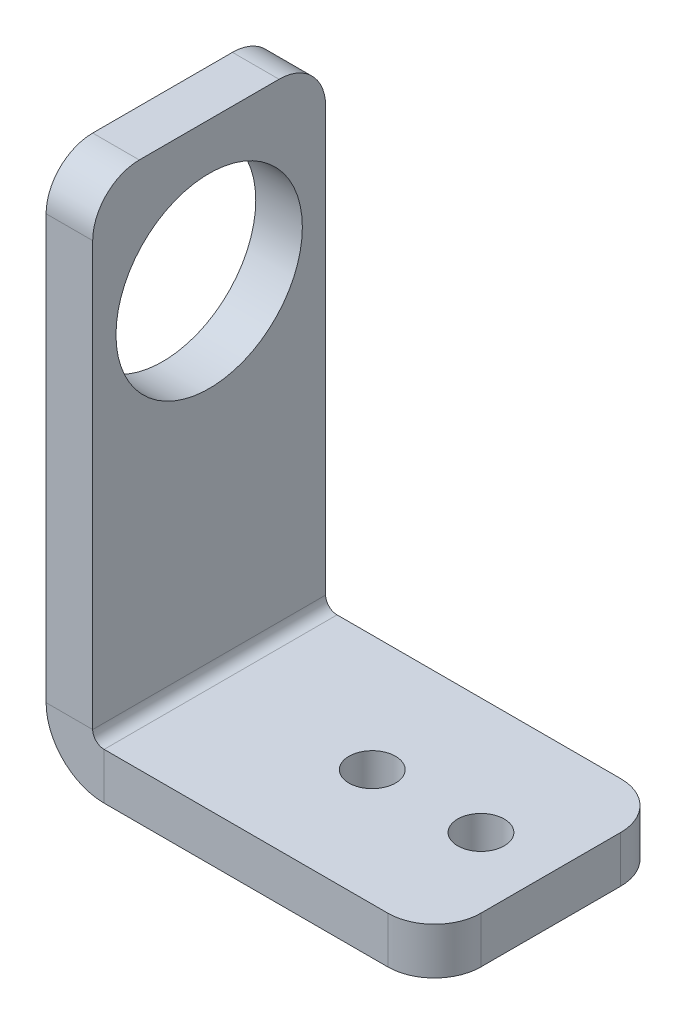
ISO-10303-21;
HEADER;
FILE_DESCRIPTION(('STEP AP214'),'2;1');
FILE_NAME('part.step','',(''),(''),'','','');
FILE_SCHEMA(('AUTOMOTIVE_DESIGN { 1 0 10303 214 1 1 1 1 }'));
ENDSEC;
DATA;
#1=APPLICATION_CONTEXT('core data for automotive mechanical design processes');
#2=APPLICATION_PROTOCOL_DEFINITION('international standard','automotive_design',2000,#1);
#3=PRODUCT_CONTEXT('',#1,'mechanical');
#4=PRODUCT('Part','Part','',(#3));
#5=PRODUCT_RELATED_PRODUCT_CATEGORY('part','',(#4));
#6=PRODUCT_DEFINITION_FORMATION('','',#4);
#7=PRODUCT_DEFINITION_CONTEXT('part definition',#1,'design');
#8=PRODUCT_DEFINITION('design','',#6,#7);
#9=PRODUCT_DEFINITION_SHAPE('','',#8);
#10=(LENGTH_UNIT() NAMED_UNIT(*) SI_UNIT(.MILLI.,.METRE.));
#11=(NAMED_UNIT(*) PLANE_ANGLE_UNIT() SI_UNIT($,.RADIAN.));
#12=(NAMED_UNIT(*) SI_UNIT($,.STERADIAN.) SOLID_ANGLE_UNIT());
#13=UNCERTAINTY_MEASURE_WITH_UNIT(LENGTH_MEASURE(1.E-05),#10,'distance_accuracy_value','');
#14=(GEOMETRIC_REPRESENTATION_CONTEXT(3) GLOBAL_UNCERTAINTY_ASSIGNED_CONTEXT((#13)) GLOBAL_UNIT_ASSIGNED_CONTEXT((#10,
#11,#12)) REPRESENTATION_CONTEXT('',''));
#15=CARTESIAN_POINT('',(0.,0.,0.));
#16=DIRECTION('',(0.,0.,1.));
#17=DIRECTION('',(1.,0.,0.));
#18=AXIS2_PLACEMENT_3D('',#15,#16,#17);
#19=CARTESIAN_POINT('',(-25.,3.7366,7.5));
#20=DIRECTION('',(0.,0.,1.));
#21=DIRECTION('',(1.,0.,0.));
#22=AXIS2_PLACEMENT_3D('',#19,#20,#21);
#23=PLANE('',#22);
#24=DIRECTION('',(1.,0.,0.));
#25=VECTOR('',#24,1.);
#26=CARTESIAN_POINT('',(-25.,3.7366,7.5));
#27=LINE('',#26,#25);
#28=CARTESIAN_POINT('',(-25.,3.7366,7.5));
#29=VERTEX_POINT('',#28);
#30=CARTESIAN_POINT('',(-22.,3.7366,7.5));
#31=VERTEX_POINT('',#30);
#32=EDGE_CURVE('E133',#29,#31,#27,.T.);
#33=ORIENTED_EDGE('',*,*,#32,.F.);
#34=CARTESIAN_POINT('',(-21.2634,3.7366,7.5));
#35=DIRECTION('',(0.,0.,1.));
#36=DIRECTION('',(1.,0.,0.));
#37=AXIS2_PLACEMENT_3D('',#34,#35,#36);
#38=CIRCLE('',#37,3.7366);
#39=CARTESIAN_POINT('',(-21.2634,0.,7.5));
#40=VERTEX_POINT('',#39);
#41=EDGE_CURVE('E137',#40,#29,#38,.F.);
#42=ORIENTED_EDGE('',*,*,#41,.F.);
#43=DIRECTION('',(0.,-1.,0.));
#44=VECTOR('',#43,1.);
#45=CARTESIAN_POINT('',(-21.2634,3.,7.5));
#46=LINE('',#45,#44);
#47=CARTESIAN_POINT('',(-21.2634,3.,7.5));
#48=VERTEX_POINT('',#47);
#49=EDGE_CURVE('E142',#48,#40,#46,.T.);
#50=ORIENTED_EDGE('',*,*,#49,.F.);
#51=CARTESIAN_POINT('',(-21.2634,3.7366,7.5));
#52=DIRECTION('',(0.,0.,1.));
#53=DIRECTION('',(1.,0.,0.));
#54=AXIS2_PLACEMENT_3D('',#51,#52,#53);
#55=CIRCLE('',#54,0.7366);
#56=EDGE_CURVE('E139',#48,#31,#55,.F.);
#57=ORIENTED_EDGE('',*,*,#56,.T.);
#58=EDGE_LOOP('',(#33,#42,#50,#57));
#59=FACE_BOUND('',#58,.T.);
#60=ADVANCED_FACE('F42',(#59),#23,.T.);
#61=CARTESIAN_POINT('',(-21.2634,3.,7.5));
#62=DIRECTION('',(0.,0.,1.));
#63=DIRECTION('',(1.,0.,0.));
#64=AXIS2_PLACEMENT_3D('',#61,#62,#63);
#65=PLANE('',#64);
#66=DIRECTION('',(0.,1.,0.));
#67=VECTOR('',#66,1.);
#68=CARTESIAN_POINT('',(-22.,0.,7.5));
#69=LINE('',#68,#67);
#70=CARTESIAN_POINT('',(-22.,31.,7.5));
#71=VERTEX_POINT('',#70);
#72=EDGE_CURVE('E160',#31,#71,#69,.T.);
#73=ORIENTED_EDGE('',*,*,#72,.T.);
#74=DIRECTION('',(1.,0.,0.));
#75=VECTOR('',#74,1.);
#76=CARTESIAN_POINT('',(-21.2634,31.,7.5));
#77=LINE('',#76,#75);
#78=CARTESIAN_POINT('',(-25.,31.,7.5));
#79=VERTEX_POINT('',#78);
#80=EDGE_CURVE('E11',#71,#79,#77,.F.);
#81=ORIENTED_EDGE('',*,*,#80,.T.);
#82=DIRECTION('',(0.,1.,0.));
#83=VECTOR('',#82,1.);
#84=CARTESIAN_POINT('',(-25.,0.,7.5));
#85=LINE('',#84,#83);
#86=EDGE_CURVE('E149',#29,#79,#85,.T.);
#87=ORIENTED_EDGE('',*,*,#86,.F.);
#88=ORIENTED_EDGE('',*,*,#32,.T.);
#89=EDGE_LOOP('',(#73,#81,#87,#88));
#90=FACE_BOUND('',#89,.T.);
#91=ADVANCED_FACE('F159',(#90),#65,.T.);
#92=CARTESIAN_POINT('',(-21.2634,0.,-7.5));
#93=DIRECTION('',(0.,0.,-1.));
#94=DIRECTION('',(-1.,0.,0.));
#95=AXIS2_PLACEMENT_3D('',#92,#93,#94);
#96=PLANE('',#95);
#97=DIRECTION('',(0.,1.,0.));
#98=VECTOR('',#97,1.);
#99=CARTESIAN_POINT('',(-21.2634,0.,-7.5));
#100=LINE('',#99,#98);
#101=CARTESIAN_POINT('',(-21.2634,0.,-7.5));
#102=VERTEX_POINT('',#101);
#103=CARTESIAN_POINT('',(-21.2634,3.,-7.5));
#104=VERTEX_POINT('',#103);
#105=EDGE_CURVE('E205',#102,#104,#100,.T.);
#106=ORIENTED_EDGE('',*,*,#105,.F.);
#107=CARTESIAN_POINT('',(-21.2634,3.7366,-7.5));
#108=DIRECTION('',(0.,0.,1.));
#109=DIRECTION('',(1.,0.,0.));
#110=AXIS2_PLACEMENT_3D('',#107,#108,#109);
#111=CIRCLE('',#110,3.7366);
#112=CARTESIAN_POINT('',(-25.,3.7366,-7.5));
#113=VERTEX_POINT('',#112);
#114=EDGE_CURVE('E179',#102,#113,#111,.F.);
#115=ORIENTED_EDGE('',*,*,#114,.T.);
#116=DIRECTION('',(-1.,0.,0.));
#117=VECTOR('',#116,1.);
#118=CARTESIAN_POINT('',(-22.,3.7366,-7.5));
#119=LINE('',#118,#117);
#120=CARTESIAN_POINT('',(-22.,3.7366,-7.5));
#121=VERTEX_POINT('',#120);
#122=EDGE_CURVE('E203',#121,#113,#119,.T.);
#123=ORIENTED_EDGE('',*,*,#122,.F.);
#124=CARTESIAN_POINT('',(-21.2634,3.7366,-7.5));
#125=DIRECTION('',(0.,0.,1.));
#126=DIRECTION('',(1.,0.,0.));
#127=AXIS2_PLACEMENT_3D('',#124,#125,#126);
#128=CIRCLE('',#127,0.7366);
#129=EDGE_CURVE('E185',#104,#121,#128,.F.);
#130=ORIENTED_EDGE('',*,*,#129,.F.);
#131=EDGE_LOOP('',(#106,#115,#123,#130));
#132=FACE_BOUND('',#131,.T.);
#133=ADVANCED_FACE('F316',(#132),#96,.T.);
#134=CARTESIAN_POINT('',(-22.,3.7366,-7.5));
#135=DIRECTION('',(0.,0.,-1.));
#136=DIRECTION('',(-1.,0.,0.));
#137=AXIS2_PLACEMENT_3D('',#134,#135,#136);
#138=PLANE('',#137);
#139=DIRECTION('',(-1.,0.,0.));
#140=VECTOR('',#139,1.);
#141=CARTESIAN_POINT('',(0.,3.,-7.5));
#142=LINE('',#141,#140);
#143=CARTESIAN_POINT('',(-3.,3.,-7.5));
#144=VERTEX_POINT('',#143);
#145=EDGE_CURVE('E183',#144,#104,#142,.T.);
#146=ORIENTED_EDGE('',*,*,#145,.F.);
#147=DIRECTION('',(0.,-1.,0.));
#148=VECTOR('',#147,1.);
#149=CARTESIAN_POINT('',(-3.,3.7366,-7.5));
#150=LINE('',#149,#148);
#151=CARTESIAN_POINT('',(-3.,0.,-7.5));
#152=VERTEX_POINT('',#151);
#153=EDGE_CURVE('E224',#144,#152,#150,.T.);
#154=ORIENTED_EDGE('',*,*,#153,.T.);
#155=DIRECTION('',(-1.,0.,0.));
#156=VECTOR('',#155,1.);
#157=CARTESIAN_POINT('',(0.,0.,-7.5));
#158=LINE('',#157,#156);
#159=EDGE_CURVE('E181',#152,#102,#158,.T.);
#160=ORIENTED_EDGE('',*,*,#159,.T.);
#161=ORIENTED_EDGE('',*,*,#105,.T.);
#162=EDGE_LOOP('',(#146,#154,#160,#161));
#163=FACE_BOUND('',#162,.T.);
#164=ADVANCED_FACE('F311',(#163),#138,.T.);
#165=CARTESIAN_POINT('',(-22.,0.,7.5));
#166=DIRECTION('',(-1.,0.,0.));
#167=DIRECTION('',(0.,0.,1.));
#168=AXIS2_PLACEMENT_3D('',#165,#166,#167);
#169=PLANE('',#168);
#170=CARTESIAN_POINT('',(-22.,25.,0.));
#171=DIRECTION('',(-1.,0.,0.));
#172=DIRECTION('',(0.,0.,1.));
#173=AXIS2_PLACEMENT_3D('',#170,#171,#172);
#174=CIRCLE('',#173,6.);
#175=CARTESIAN_POINT('',(-22.,25.,6.));
#176=VERTEX_POINT('',#175);
#177=EDGE_CURVE('E177',#176,#176,#174,.T.);
#178=ORIENTED_EDGE('',*,*,#177,.T.);
#179=EDGE_LOOP('',(#178));
#180=FACE_BOUND('',#179,.T.);
#181=DIRECTION('',(0.,1.,0.));
#182=VECTOR('',#181,1.);
#183=CARTESIAN_POINT('',(-22.,0.,-7.5));
#184=LINE('',#183,#182);
#185=CARTESIAN_POINT('',(-22.,31.,-7.5));
#186=VERTEX_POINT('',#185);
#187=EDGE_CURVE('E174',#121,#186,#184,.T.);
#188=ORIENTED_EDGE('',*,*,#187,.T.);
#189=CARTESIAN_POINT('',(-22.,31.,-4.5));
#190=DIRECTION('',(-1.,0.,0.));
#191=DIRECTION('',(0.,0.,1.));
#192=AXIS2_PLACEMENT_3D('',#189,#190,#191);
#193=CIRCLE('',#192,3.);
#194=CARTESIAN_POINT('',(-22.,34.,-4.5));
#195=VERTEX_POINT('',#194);
#196=EDGE_CURVE('E232',#186,#195,#193,.F.);
#197=ORIENTED_EDGE('',*,*,#196,.T.);
#198=DIRECTION('',(0.,0.,-1.));
#199=VECTOR('',#198,1.);
#200=CARTESIAN_POINT('',(-22.,34.,7.5));
#201=LINE('',#200,#199);
#202=CARTESIAN_POINT('',(-22.,34.,4.5));
#203=VERTEX_POINT('',#202);
#204=EDGE_CURVE('E201',#203,#195,#201,.T.);
#205=ORIENTED_EDGE('',*,*,#204,.F.);
#206=CARTESIAN_POINT('',(-22.,31.,4.5));
#207=DIRECTION('',(-1.,0.,0.));
#208=DIRECTION('',(0.,0.,1.));
#209=AXIS2_PLACEMENT_3D('',#206,#207,#208);
#210=CIRCLE('',#209,3.);
#211=EDGE_CURVE('E230',#203,#71,#210,.F.);
#212=ORIENTED_EDGE('',*,*,#211,.T.);
#213=ORIENTED_EDGE('',*,*,#72,.F.);
#214=DIRECTION('',(0.,0.,-1.));
#215=VECTOR('',#214,1.);
#216=CARTESIAN_POINT('',(-22.,3.7366,7.5));
#217=LINE('',#216,#215);
#218=EDGE_CURVE('E173',#31,#121,#217,.T.);
#219=ORIENTED_EDGE('',*,*,#218,.T.);
#220=EDGE_LOOP('',(#188,#197,#205,#212,#213,#219));
#221=FACE_BOUND('',#220,.T.);
#222=ADVANCED_FACE('F248',(#180,#221),#169,.F.);
#223=CARTESIAN_POINT('',(-25.,34.,7.5));
#224=DIRECTION('',(0.,1.,0.));
#225=DIRECTION('',(0.,0.,1.));
#226=AXIS2_PLACEMENT_3D('',#223,#224,#225);
#227=PLANE('',#226);
#228=ORIENTED_EDGE('',*,*,#204,.T.);
#229=DIRECTION('',(1.,0.,0.));
#230=VECTOR('',#229,1.);
#231=CARTESIAN_POINT('',(-25.,34.,-4.5));
#232=LINE('',#231,#230);
#233=CARTESIAN_POINT('',(-25.,34.,-4.5));
#234=VERTEX_POINT('',#233);
#235=EDGE_CURVE('E63',#195,#234,#232,.F.);
#236=ORIENTED_EDGE('',*,*,#235,.T.);
#237=DIRECTION('',(0.,0.,-1.));
#238=VECTOR('',#237,1.);
#239=CARTESIAN_POINT('',(-25.,34.,7.5));
#240=LINE('',#239,#238);
#241=CARTESIAN_POINT('',(-25.,34.,4.5));
#242=VERTEX_POINT('',#241);
#243=EDGE_CURVE('E156',#242,#234,#240,.T.);
#244=ORIENTED_EDGE('',*,*,#243,.F.);
#245=DIRECTION('',(1.,0.,0.));
#246=VECTOR('',#245,1.);
#247=CARTESIAN_POINT('',(-25.,34.,4.5));
#248=LINE('',#247,#246);
#249=EDGE_CURVE('E234',#242,#203,#248,.T.);
#250=ORIENTED_EDGE('',*,*,#249,.T.);
#251=EDGE_LOOP('',(#228,#236,#244,#250));
#252=FACE_BOUND('',#251,.T.);
#253=ADVANCED_FACE('F249',(#252),#227,.T.);
#254=CARTESIAN_POINT('',(-25.,0.,7.5));
#255=DIRECTION('',(-1.,0.,0.));
#256=DIRECTION('',(0.,0.,1.));
#257=AXIS2_PLACEMENT_3D('',#254,#255,#256);
#258=PLANE('',#257);
#259=CARTESIAN_POINT('',(-25.,25.,0.));
#260=DIRECTION('',(-1.,0.,0.));
#261=DIRECTION('',(0.,0.,1.));
#262=AXIS2_PLACEMENT_3D('',#259,#260,#261);
#263=CIRCLE('',#262,6.);
#264=CARTESIAN_POINT('',(-25.,25.,6.));
#265=VERTEX_POINT('',#264);
#266=EDGE_CURVE('E256',#265,#265,#263,.T.);
#267=ORIENTED_EDGE('',*,*,#266,.F.);
#268=EDGE_LOOP('',(#267));
#269=FACE_BOUND('',#268,.T.);
#270=ORIENTED_EDGE('',*,*,#243,.T.);
#271=CARTESIAN_POINT('',(-25.,31.,-4.5));
#272=DIRECTION('',(-1.,0.,0.));
#273=DIRECTION('',(0.,0.,1.));
#274=AXIS2_PLACEMENT_3D('',#271,#272,#273);
#275=CIRCLE('',#274,3.);
#276=CARTESIAN_POINT('',(-25.,31.,-7.5));
#277=VERTEX_POINT('',#276);
#278=EDGE_CURVE('E50',#234,#277,#275,.T.);
#279=ORIENTED_EDGE('',*,*,#278,.T.);
#280=DIRECTION('',(0.,1.,0.));
#281=VECTOR('',#280,1.);
#282=CARTESIAN_POINT('',(-25.,0.,-7.5));
#283=LINE('',#282,#281);
#284=EDGE_CURVE('E152',#113,#277,#283,.T.);
#285=ORIENTED_EDGE('',*,*,#284,.F.);
#286=DIRECTION('',(0.,0.,-1.));
#287=VECTOR('',#286,1.);
#288=CARTESIAN_POINT('',(-25.,3.7366,7.5));
#289=LINE('',#288,#287);
#290=EDGE_CURVE('E147',#29,#113,#289,.T.);
#291=ORIENTED_EDGE('',*,*,#290,.F.);
#292=ORIENTED_EDGE('',*,*,#86,.T.);
#293=CARTESIAN_POINT('',(-25.,31.,4.5));
#294=DIRECTION('',(-1.,0.,0.));
#295=DIRECTION('',(0.,0.,1.));
#296=AXIS2_PLACEMENT_3D('',#293,#294,#295);
#297=CIRCLE('',#296,3.);
#298=EDGE_CURVE('E238',#79,#242,#297,.T.);
#299=ORIENTED_EDGE('',*,*,#298,.T.);
#300=EDGE_LOOP('',(#270,#279,#285,#291,#292,#299));
#301=FACE_BOUND('',#300,.T.);
#302=ADVANCED_FACE('F148',(#269,#301),#258,.T.);
#303=CARTESIAN_POINT('',(-21.2634,3.7366,7.5));
#304=DIRECTION('',(0.,0.,-1.));
#305=DIRECTION('',(-1.,0.,0.));
#306=AXIS2_PLACEMENT_3D('',#303,#304,#305);
#307=CYLINDRICAL_SURFACE('',#306,3.7366);
#308=ORIENTED_EDGE('',*,*,#114,.F.);
#309=DIRECTION('',(0.,0.,-1.));
#310=VECTOR('',#309,1.);
#311=CARTESIAN_POINT('',(-21.2634,0.,7.5));
#312=LINE('',#311,#310);
#313=EDGE_CURVE('E157',#40,#102,#312,.T.);
#314=ORIENTED_EDGE('',*,*,#313,.F.);
#315=ORIENTED_EDGE('',*,*,#41,.T.);
#316=ORIENTED_EDGE('',*,*,#290,.T.);
#317=EDGE_LOOP('',(#308,#314,#315,#316));
#318=FACE_BOUND('',#317,.T.);
#319=ADVANCED_FACE('F163',(#318),#307,.T.);
#320=CARTESIAN_POINT('',(0.,0.,7.5));
#321=DIRECTION('',(0.,-1.,0.));
#322=DIRECTION('',(1.,0.,0.));
#323=AXIS2_PLACEMENT_3D('',#320,#321,#322);
#324=PLANE('',#323);
#325=CARTESIAN_POINT('',(-4.5,0.,0.));
#326=DIRECTION('',(0.,1.,0.));
#327=DIRECTION('',(-1.,0.,0.));
#328=AXIS2_PLACEMENT_3D('',#325,#326,#327);
#329=CIRCLE('',#328,1.5);
#330=CARTESIAN_POINT('',(-6.,0.,0.));
#331=VERTEX_POINT('',#330);
#332=EDGE_CURVE('E259',#331,#331,#329,.T.);
#333=ORIENTED_EDGE('',*,*,#332,.T.);
#334=EDGE_LOOP('',(#333));
#335=FACE_BOUND('',#334,.T.);
#336=CARTESIAN_POINT('',(-11.5,0.,0.));
#337=DIRECTION('',(0.,1.,0.));
#338=DIRECTION('',(-1.,0.,0.));
#339=AXIS2_PLACEMENT_3D('',#336,#337,#338);
#340=CIRCLE('',#339,1.5);
#341=CARTESIAN_POINT('',(-13.,0.,0.));
#342=VERTEX_POINT('',#341);
#343=EDGE_CURVE('E260',#342,#342,#340,.T.);
#344=ORIENTED_EDGE('',*,*,#343,.T.);
#345=EDGE_LOOP('',(#344));
#346=FACE_BOUND('',#345,.T.);
#347=DIRECTION('',(0.,0.,-1.));
#348=VECTOR('',#347,1.);
#349=CARTESIAN_POINT('',(0.,0.,7.5));
#350=LINE('',#349,#348);
#351=CARTESIAN_POINT('',(0.,0.,4.5));
#352=VERTEX_POINT('',#351);
#353=CARTESIAN_POINT('',(0.,0.,-4.5));
#354=VERTEX_POINT('',#353);
#355=EDGE_CURVE('E196',#352,#354,#350,.T.);
#356=ORIENTED_EDGE('',*,*,#355,.F.);
#357=CARTESIAN_POINT('',(-3.,0.,4.5));
#358=DIRECTION('',(0.,-1.,0.));
#359=DIRECTION('',(1.,0.,0.));
#360=AXIS2_PLACEMENT_3D('',#357,#358,#359);
#361=CIRCLE('',#360,3.);
#362=CARTESIAN_POINT('',(-3.,0.,7.5));
#363=VERTEX_POINT('',#362);
#364=EDGE_CURVE('E216',#352,#363,#361,.T.);
#365=ORIENTED_EDGE('',*,*,#364,.T.);
#366=DIRECTION('',(-1.,0.,0.));
#367=VECTOR('',#366,1.);
#368=CARTESIAN_POINT('',(0.,0.,7.5));
#369=LINE('',#368,#367);
#370=EDGE_CURVE('E165',#363,#40,#369,.T.);
#371=ORIENTED_EDGE('',*,*,#370,.T.);
#372=ORIENTED_EDGE('',*,*,#313,.T.);
#373=ORIENTED_EDGE('',*,*,#159,.F.);
#374=CARTESIAN_POINT('',(-3.,0.,-4.5));
#375=DIRECTION('',(0.,-1.,0.));
#376=DIRECTION('',(1.,0.,0.));
#377=AXIS2_PLACEMENT_3D('',#374,#375,#376);
#378=CIRCLE('',#377,3.);
#379=EDGE_CURVE('E214',#152,#354,#378,.T.);
#380=ORIENTED_EDGE('',*,*,#379,.T.);
#381=EDGE_LOOP('',(#356,#365,#371,#372,#373,#380));
#382=FACE_BOUND('',#381,.T.);
#383=ADVANCED_FACE('F272',(#335,#346,#382),#324,.T.);
#384=CARTESIAN_POINT('',(0.,3.,7.5));
#385=DIRECTION('',(1.,0.,0.));
#386=DIRECTION('',(0.,1.,0.));
#387=AXIS2_PLACEMENT_3D('',#384,#385,#386);
#388=PLANE('',#387);
#389=DIRECTION('',(0.,0.,-1.));
#390=VECTOR('',#389,1.);
#391=CARTESIAN_POINT('',(0.,3.,7.5));
#392=LINE('',#391,#390);
#393=CARTESIAN_POINT('',(0.,3.,4.5));
#394=VERTEX_POINT('',#393);
#395=CARTESIAN_POINT('',(0.,3.,-4.5));
#396=VERTEX_POINT('',#395);
#397=EDGE_CURVE('E193',#394,#396,#392,.T.);
#398=ORIENTED_EDGE('',*,*,#397,.F.);
#399=DIRECTION('',(0.,-1.,0.));
#400=VECTOR('',#399,1.);
#401=CARTESIAN_POINT('',(0.,3.,4.5));
#402=LINE('',#401,#400);
#403=EDGE_CURVE('E211',#394,#352,#402,.T.);
#404=ORIENTED_EDGE('',*,*,#403,.T.);
#405=ORIENTED_EDGE('',*,*,#355,.T.);
#406=DIRECTION('',(0.,-1.,0.));
#407=VECTOR('',#406,1.);
#408=CARTESIAN_POINT('',(0.,3.,-4.5));
#409=LINE('',#408,#407);
#410=EDGE_CURVE('E141',#354,#396,#409,.F.);
#411=ORIENTED_EDGE('',*,*,#410,.T.);
#412=EDGE_LOOP('',(#398,#404,#405,#411));
#413=FACE_BOUND('',#412,.T.);
#414=ADVANCED_FACE('F287',(#413),#388,.T.);
#415=CARTESIAN_POINT('',(0.,3.,7.5));
#416=DIRECTION('',(0.,-1.,0.));
#417=DIRECTION('',(1.,0.,0.));
#418=AXIS2_PLACEMENT_3D('',#415,#416,#417);
#419=PLANE('',#418);
#420=CARTESIAN_POINT('',(-4.5,3.,0.));
#421=DIRECTION('',(0.,1.,0.));
#422=DIRECTION('',(-1.,0.,0.));
#423=AXIS2_PLACEMENT_3D('',#420,#421,#422);
#424=CIRCLE('',#423,1.5);
#425=CARTESIAN_POINT('',(-6.,3.,0.));
#426=VERTEX_POINT('',#425);
#427=EDGE_CURVE('E266',#426,#426,#424,.T.);
#428=ORIENTED_EDGE('',*,*,#427,.F.);
#429=EDGE_LOOP('',(#428));
#430=FACE_BOUND('',#429,.T.);
#431=CARTESIAN_POINT('',(-11.5,3.,0.));
#432=DIRECTION('',(0.,1.,0.));
#433=DIRECTION('',(-1.,0.,0.));
#434=AXIS2_PLACEMENT_3D('',#431,#432,#433);
#435=CIRCLE('',#434,1.5);
#436=CARTESIAN_POINT('',(-13.,3.,0.));
#437=VERTEX_POINT('',#436);
#438=EDGE_CURVE('E263',#437,#437,#435,.T.);
#439=ORIENTED_EDGE('',*,*,#438,.F.);
#440=EDGE_LOOP('',(#439));
#441=FACE_BOUND('',#440,.T.);
#442=DIRECTION('',(-1.,0.,0.));
#443=VECTOR('',#442,1.);
#444=CARTESIAN_POINT('',(0.,3.,7.5));
#445=LINE('',#444,#443);
#446=CARTESIAN_POINT('',(-3.,3.,7.5));
#447=VERTEX_POINT('',#446);
#448=EDGE_CURVE('E167',#447,#48,#445,.T.);
#449=ORIENTED_EDGE('',*,*,#448,.F.);
#450=CARTESIAN_POINT('',(-3.,3.,4.5));
#451=DIRECTION('',(0.,-1.,0.));
#452=DIRECTION('',(1.,0.,0.));
#453=AXIS2_PLACEMENT_3D('',#450,#451,#452);
#454=CIRCLE('',#453,3.);
#455=EDGE_CURVE('E222',#447,#394,#454,.F.);
#456=ORIENTED_EDGE('',*,*,#455,.T.);
#457=ORIENTED_EDGE('',*,*,#397,.T.);
#458=CARTESIAN_POINT('',(-3.,3.,-4.5));
#459=DIRECTION('',(0.,-1.,0.));
#460=DIRECTION('',(1.,0.,0.));
#461=AXIS2_PLACEMENT_3D('',#458,#459,#460);
#462=CIRCLE('',#461,3.);
#463=EDGE_CURVE('E220',#396,#144,#462,.F.);
#464=ORIENTED_EDGE('',*,*,#463,.T.);
#465=ORIENTED_EDGE('',*,*,#145,.T.);
#466=DIRECTION('',(0.,0.,-1.));
#467=VECTOR('',#466,1.);
#468=CARTESIAN_POINT('',(-21.2634,3.,7.5));
#469=LINE('',#468,#467);
#470=EDGE_CURVE('E190',#48,#104,#469,.T.);
#471=ORIENTED_EDGE('',*,*,#470,.F.);
#472=EDGE_LOOP('',(#449,#456,#457,#464,#465,#471));
#473=FACE_BOUND('',#472,.T.);
#474=ADVANCED_FACE('F283',(#430,#441,#473),#419,.F.);
#475=CARTESIAN_POINT('',(-21.2634,3.7366,7.5));
#476=DIRECTION('',(0.,0.,-1.));
#477=DIRECTION('',(-1.,0.,0.));
#478=AXIS2_PLACEMENT_3D('',#475,#476,#477);
#479=CYLINDRICAL_SURFACE('',#478,0.7366);
#480=ORIENTED_EDGE('',*,*,#129,.T.);
#481=ORIENTED_EDGE('',*,*,#218,.F.);
#482=ORIENTED_EDGE('',*,*,#56,.F.);
#483=ORIENTED_EDGE('',*,*,#470,.T.);
#484=EDGE_LOOP('',(#480,#481,#482,#483));
#485=FACE_BOUND('',#484,.T.);
#486=ADVANCED_FACE('F286',(#485),#479,.F.);
#487=CARTESIAN_POINT('',(-21.2634,3.7366,7.5));
#488=DIRECTION('',(0.,0.,1.));
#489=DIRECTION('',(1.,0.,0.));
#490=AXIS2_PLACEMENT_3D('',#487,#488,#489);
#491=PLANE('',#490);
#492=ORIENTED_EDGE('',*,*,#370,.F.);
#493=DIRECTION('',(0.,-1.,0.));
#494=VECTOR('',#493,1.);
#495=CARTESIAN_POINT('',(-3.,3.7366,7.5));
#496=LINE('',#495,#494);
#497=EDGE_CURVE('E218',#363,#447,#496,.F.);
#498=ORIENTED_EDGE('',*,*,#497,.T.);
#499=ORIENTED_EDGE('',*,*,#448,.T.);
#500=ORIENTED_EDGE('',*,*,#49,.T.);
#501=EDGE_LOOP('',(#492,#498,#499,#500));
#502=FACE_BOUND('',#501,.T.);
#503=ADVANCED_FACE('F370',(#502),#491,.T.);
#504=CARTESIAN_POINT('',(-21.2634,3.7366,-7.5));
#505=DIRECTION('',(0.,0.,1.));
#506=DIRECTION('',(1.,0.,0.));
#507=AXIS2_PLACEMENT_3D('',#504,#505,#506);
#508=PLANE('',#507);
#509=ORIENTED_EDGE('',*,*,#284,.T.);
#510=DIRECTION('',(1.,0.,0.));
#511=VECTOR('',#510,1.);
#512=CARTESIAN_POINT('',(-22.,31.,-7.5));
#513=LINE('',#512,#511);
#514=EDGE_CURVE('E227',#277,#186,#513,.T.);
#515=ORIENTED_EDGE('',*,*,#514,.T.);
#516=ORIENTED_EDGE('',*,*,#187,.F.);
#517=ORIENTED_EDGE('',*,*,#122,.T.);
#518=EDGE_LOOP('',(#509,#515,#516,#517));
#519=FACE_BOUND('',#518,.T.);
#520=ADVANCED_FACE('F243',(#519),#508,.F.);
#521=CARTESIAN_POINT('',(0.,25.,0.));
#522=DIRECTION('',(-1.,0.,0.));
#523=DIRECTION('',(0.,0.,1.));
#524=AXIS2_PLACEMENT_3D('',#521,#522,#523);
#525=CYLINDRICAL_SURFACE('',#524,6.);
#526=ORIENTED_EDGE('',*,*,#266,.T.);
#527=EDGE_LOOP('',(#526));
#528=FACE_BOUND('',#527,.T.);
#529=ORIENTED_EDGE('',*,*,#177,.F.);
#530=EDGE_LOOP('',(#529));
#531=FACE_BOUND('',#530,.T.);
#532=ADVANCED_FACE('F369',(#528,#531),#525,.F.);
#533=CARTESIAN_POINT('',(-11.5,0.,0.));
#534=DIRECTION('',(0.,1.,0.));
#535=DIRECTION('',(-1.,0.,0.));
#536=AXIS2_PLACEMENT_3D('',#533,#534,#535);
#537=CYLINDRICAL_SURFACE('',#536,1.5);
#538=ORIENTED_EDGE('',*,*,#343,.F.);
#539=EDGE_LOOP('',(#538));
#540=FACE_BOUND('',#539,.T.);
#541=ORIENTED_EDGE('',*,*,#438,.T.);
#542=EDGE_LOOP('',(#541));
#543=FACE_BOUND('',#542,.T.);
#544=ADVANCED_FACE('F279',(#540,#543),#537,.F.);
#545=CARTESIAN_POINT('',(-4.5,0.,0.));
#546=DIRECTION('',(0.,1.,0.));
#547=DIRECTION('',(-1.,0.,0.));
#548=AXIS2_PLACEMENT_3D('',#545,#546,#547);
#549=CYLINDRICAL_SURFACE('',#548,1.5);
#550=ORIENTED_EDGE('',*,*,#332,.F.);
#551=EDGE_LOOP('',(#550));
#552=FACE_BOUND('',#551,.T.);
#553=ORIENTED_EDGE('',*,*,#427,.T.);
#554=EDGE_LOOP('',(#553));
#555=FACE_BOUND('',#554,.T.);
#556=ADVANCED_FACE('F275',(#552,#555),#549,.F.);
#557=CARTESIAN_POINT('',(-3.,3.,4.5));
#558=DIRECTION('',(0.,-1.,0.));
#559=DIRECTION('',(1.,0.,0.));
#560=AXIS2_PLACEMENT_3D('',#557,#558,#559);
#561=CYLINDRICAL_SURFACE('',#560,3.);
#562=ORIENTED_EDGE('',*,*,#455,.F.);
#563=ORIENTED_EDGE('',*,*,#497,.F.);
#564=ORIENTED_EDGE('',*,*,#364,.F.);
#565=ORIENTED_EDGE('',*,*,#403,.F.);
#566=EDGE_LOOP('',(#562,#563,#564,#565));
#567=FACE_BOUND('',#566,.T.);
#568=ADVANCED_FACE('F278',(#567),#561,.T.);
#569=CARTESIAN_POINT('',(-3.,3.7366,-4.5));
#570=DIRECTION('',(0.,-1.,0.));
#571=DIRECTION('',(1.,0.,0.));
#572=AXIS2_PLACEMENT_3D('',#569,#570,#571);
#573=CYLINDRICAL_SURFACE('',#572,3.);
#574=ORIENTED_EDGE('',*,*,#463,.F.);
#575=ORIENTED_EDGE('',*,*,#410,.F.);
#576=ORIENTED_EDGE('',*,*,#379,.F.);
#577=ORIENTED_EDGE('',*,*,#153,.F.);
#578=EDGE_LOOP('',(#574,#575,#576,#577));
#579=FACE_BOUND('',#578,.T.);
#580=ADVANCED_FACE('F308',(#579),#573,.T.);
#581=CARTESIAN_POINT('',(-21.2634,31.,-4.5));
#582=DIRECTION('',(-1.,0.,0.));
#583=DIRECTION('',(0.,0.,1.));
#584=AXIS2_PLACEMENT_3D('',#581,#582,#583);
#585=CYLINDRICAL_SURFACE('',#584,3.);
#586=ORIENTED_EDGE('',*,*,#278,.F.);
#587=ORIENTED_EDGE('',*,*,#235,.F.);
#588=ORIENTED_EDGE('',*,*,#196,.F.);
#589=ORIENTED_EDGE('',*,*,#514,.F.);
#590=EDGE_LOOP('',(#586,#587,#588,#589));
#591=FACE_BOUND('',#590,.T.);
#592=ADVANCED_FACE('F245',(#591),#585,.T.);
#593=CARTESIAN_POINT('',(-25.,31.,4.5));
#594=DIRECTION('',(1.,0.,0.));
#595=DIRECTION('',(0.,0.,-1.));
#596=AXIS2_PLACEMENT_3D('',#593,#594,#595);
#597=CYLINDRICAL_SURFACE('',#596,3.);
#598=ORIENTED_EDGE('',*,*,#298,.F.);
#599=ORIENTED_EDGE('',*,*,#80,.F.);
#600=ORIENTED_EDGE('',*,*,#211,.F.);
#601=ORIENTED_EDGE('',*,*,#249,.F.);
#602=EDGE_LOOP('',(#598,#599,#600,#601));
#603=FACE_BOUND('',#602,.T.);
#604=ADVANCED_FACE('F44',(#603),#597,.T.);
#605=CLOSED_SHELL('',(#60,#91,#133,#164,#222,#253,#302,#319,#383,#414,#474,#486,#503,#520,#532,
#544,#556,#568,#580,#592,#604));
#606=MANIFOLD_SOLID_BREP('B2',#605);
#607=ADVANCED_BREP_SHAPE_REPRESENTATION('',(#18,#606),#14);
#608=SHAPE_DEFINITION_REPRESENTATION(#9,#607);
ENDSEC;
END-ISO-10303-21;
